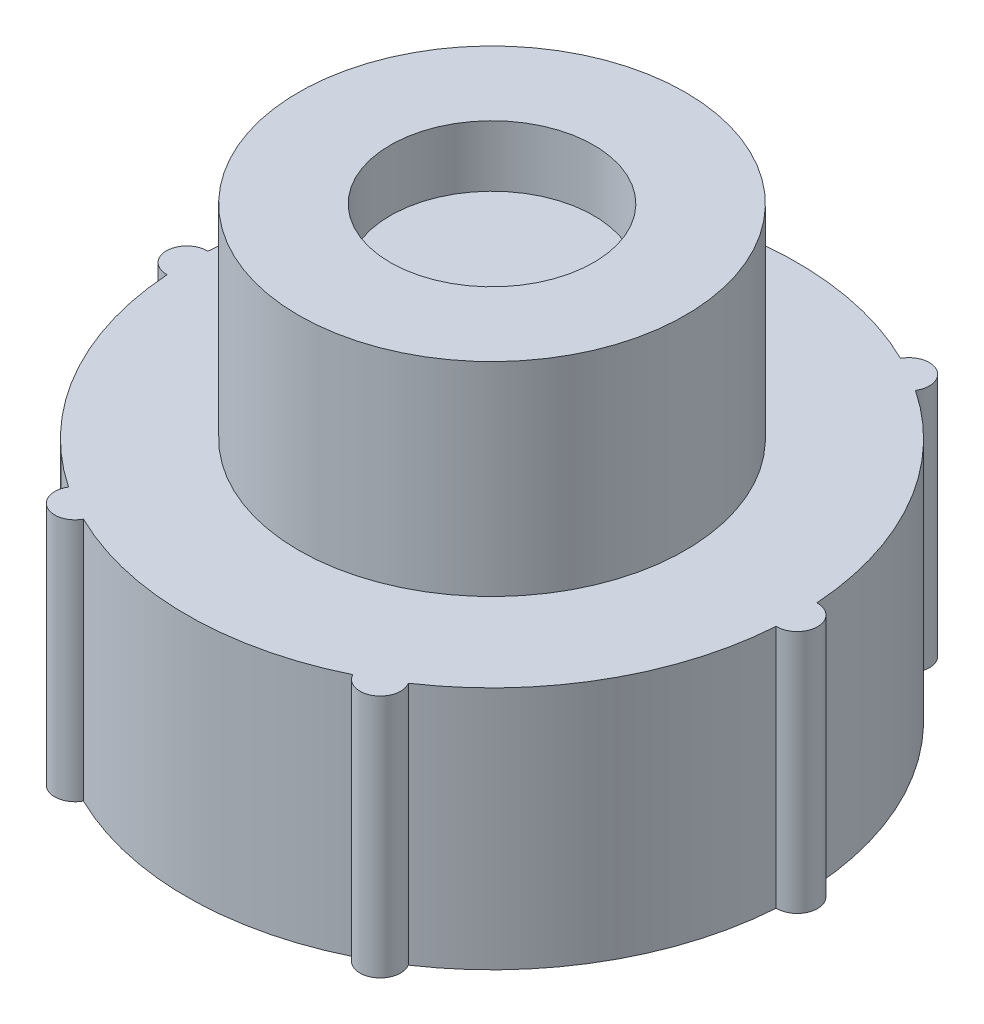
ISO-10303-21;
HEADER;
FILE_DESCRIPTION(('STEP AP214'),'2;1');
FILE_NAME('part.step','',(''),(''),'','','');
FILE_SCHEMA(('AUTOMOTIVE_DESIGN { 1 0 10303 214 1 1 1 1 }'));
ENDSEC;
DATA;
#1=APPLICATION_CONTEXT('core data for automotive mechanical design processes');
#2=APPLICATION_PROTOCOL_DEFINITION('international standard','automotive_design',2000,#1);
#3=PRODUCT_CONTEXT('',#1,'mechanical');
#4=PRODUCT('Part','Part','',(#3));
#5=PRODUCT_RELATED_PRODUCT_CATEGORY('part','',(#4));
#6=PRODUCT_DEFINITION_FORMATION('','',#4);
#7=PRODUCT_DEFINITION_CONTEXT('part definition',#1,'design');
#8=PRODUCT_DEFINITION('design','',#6,#7);
#9=PRODUCT_DEFINITION_SHAPE('','',#8);
#10=(LENGTH_UNIT() NAMED_UNIT(*) SI_UNIT(.MILLI.,.METRE.));
#11=(NAMED_UNIT(*) PLANE_ANGLE_UNIT() SI_UNIT($,.RADIAN.));
#12=(NAMED_UNIT(*) SI_UNIT($,.STERADIAN.) SOLID_ANGLE_UNIT());
#13=UNCERTAINTY_MEASURE_WITH_UNIT(LENGTH_MEASURE(1.E-05),#10,'distance_accuracy_value','');
#14=(GEOMETRIC_REPRESENTATION_CONTEXT(3) GLOBAL_UNCERTAINTY_ASSIGNED_CONTEXT((#13)) GLOBAL_UNIT_ASSIGNED_CONTEXT((#10,
#11,#12)) REPRESENTATION_CONTEXT('',''));
#15=CARTESIAN_POINT('',(0.,0.,0.));
#16=DIRECTION('',(0.,0.,1.));
#17=DIRECTION('',(1.,0.,0.));
#18=AXIS2_PLACEMENT_3D('',#15,#16,#17);
#19=CARTESIAN_POINT('',(0.,12.,0.));
#20=DIRECTION('',(0.,-1.,0.));
#21=DIRECTION('',(0.,0.,-1.));
#22=AXIS2_PLACEMENT_3D('',#19,#20,#21);
#23=CYLINDRICAL_SURFACE('',#22,15.);
#24=CARTESIAN_POINT('',(0.,0.,0.));
#25=DIRECTION('',(0.,1.,0.));
#26=DIRECTION('',(0.,0.,1.));
#27=AXIS2_PLACEMENT_3D('',#24,#25,#26);
#28=CIRCLE('',#27,15.);
#29=CARTESIAN_POINT('',(-6.61778918849326,0.,13.461235688326));
#30=VERTEX_POINT('',#29);
#31=CARTESIAN_POINT('',(6.61778918849357,0.,13.4612356883259));
#32=VERTEX_POINT('',#31);
#33=EDGE_CURVE('E136',#30,#32,#28,.T.);
#34=ORIENTED_EDGE('',*,*,#33,.T.);
#35=DIRECTION('',(0.,-1.,0.));
#36=VECTOR('',#35,1.);
#37=CARTESIAN_POINT('',(6.61778918849357,6.,13.4612356883259));
#38=LINE('',#37,#36);
#39=CARTESIAN_POINT('',(6.61778918849357,12.,13.4612356883259));
#40=VERTEX_POINT('',#39);
#41=EDGE_CURVE('E122',#32,#40,#38,.F.);
#42=ORIENTED_EDGE('',*,*,#41,.T.);
#43=CARTESIAN_POINT('',(0.,12.,0.));
#44=DIRECTION('',(0.,1.,0.));
#45=DIRECTION('',(0.,0.,1.));
#46=AXIS2_PLACEMENT_3D('',#43,#44,#45);
#47=CIRCLE('',#46,15.);
#48=CARTESIAN_POINT('',(-6.61778918849329,12.,13.461235688326));
#49=VERTEX_POINT('',#48);
#50=EDGE_CURVE('E158',#49,#40,#47,.T.);
#51=ORIENTED_EDGE('',*,*,#50,.F.);
#52=DIRECTION('',(0.,-1.,0.));
#53=VECTOR('',#52,1.);
#54=CARTESIAN_POINT('',(-6.61778918849329,6.,13.461235688326));
#55=LINE('',#54,#53);
#56=EDGE_CURVE('E140',#49,#30,#55,.T.);
#57=ORIENTED_EDGE('',*,*,#56,.T.);
#58=EDGE_LOOP('',(#34,#42,#51,#57));
#59=FACE_BOUND('',#58,.T.);
#60=ADVANCED_FACE('F33',(#59),#23,.T.);
#61=CARTESIAN_POINT('',(-14.9666666666667,0.,0.99944429003777));
#62=VERTEX_POINT('',#61);
#63=CARTESIAN_POINT('',(-8.34887747817314,0.,12.4617913982883));
#64=VERTEX_POINT('',#63);
#65=EDGE_CURVE('E141',#62,#64,#28,.T.);
#66=ORIENTED_EDGE('',*,*,#65,.T.);
#67=DIRECTION('',(0.,-1.,0.));
#68=VECTOR('',#67,1.);
#69=CARTESIAN_POINT('',(-8.34887747817314,6.,12.4617913982883));
#70=LINE('',#69,#68);
#71=CARTESIAN_POINT('',(-8.34887747817314,12.,12.4617913982883));
#72=VERTEX_POINT('',#71);
#73=EDGE_CURVE('E182',#64,#72,#70,.F.);
#74=ORIENTED_EDGE('',*,*,#73,.T.);
#75=CARTESIAN_POINT('',(-14.9666666666667,12.,0.999444290037769));
#76=VERTEX_POINT('',#75);
#77=EDGE_CURVE('E230',#76,#72,#47,.T.);
#78=ORIENTED_EDGE('',*,*,#77,.F.);
#79=DIRECTION('',(0.,-1.,0.));
#80=VECTOR('',#79,1.);
#81=CARTESIAN_POINT('',(-14.9666666666667,6.,0.999444290037769));
#82=LINE('',#81,#80);
#83=EDGE_CURVE('E184',#76,#62,#82,.T.);
#84=ORIENTED_EDGE('',*,*,#83,.T.);
#85=EDGE_LOOP('',(#66,#74,#78,#84));
#86=FACE_BOUND('',#85,.T.);
#87=ADVANCED_FACE('F262',(#86),#23,.T.);
#88=CARTESIAN_POINT('',(-8.34887747817333,0.,-12.4617913982882));
#89=VERTEX_POINT('',#88);
#90=CARTESIAN_POINT('',(-14.9666666666667,0.,-0.99944429003756));
#91=VERTEX_POINT('',#90);
#92=EDGE_CURVE('E143',#89,#91,#28,.T.);
#93=ORIENTED_EDGE('',*,*,#92,.T.);
#94=DIRECTION('',(0.,-1.,0.));
#95=VECTOR('',#94,1.);
#96=CARTESIAN_POINT('',(-14.9666666666667,6.,-0.99944429003756));
#97=LINE('',#96,#95);
#98=CARTESIAN_POINT('',(-14.9666666666667,12.,-0.99944429003756));
#99=VERTEX_POINT('',#98);
#100=EDGE_CURVE('E171',#91,#99,#97,.F.);
#101=ORIENTED_EDGE('',*,*,#100,.T.);
#102=CARTESIAN_POINT('',(-8.34887747817331,12.,-12.4617913982882));
#103=VERTEX_POINT('',#102);
#104=EDGE_CURVE('E227',#103,#99,#47,.T.);
#105=ORIENTED_EDGE('',*,*,#104,.F.);
#106=DIRECTION('',(0.,-1.,0.));
#107=VECTOR('',#106,1.);
#108=CARTESIAN_POINT('',(-8.34887747817331,6.,-12.4617913982882));
#109=LINE('',#108,#107);
#110=EDGE_CURVE('E173',#103,#89,#109,.T.);
#111=ORIENTED_EDGE('',*,*,#110,.T.);
#112=EDGE_LOOP('',(#93,#101,#105,#111));
#113=FACE_BOUND('',#112,.T.);
#114=ADVANCED_FACE('F169',(#113),#23,.T.);
#115=CARTESIAN_POINT('',(6.61778918849336,0.,-13.461235688326));
#116=VERTEX_POINT('',#115);
#117=CARTESIAN_POINT('',(-6.61778918849348,0.,-13.4612356883259));
#118=VERTEX_POINT('',#117);
#119=EDGE_CURVE('E153',#116,#118,#28,.T.);
#120=ORIENTED_EDGE('',*,*,#119,.T.);
#121=DIRECTION('',(0.,-1.,0.));
#122=VECTOR('',#121,1.);
#123=CARTESIAN_POINT('',(-6.61778918849348,6.,-13.4612356883259));
#124=LINE('',#123,#122);
#125=CARTESIAN_POINT('',(-6.61778918849348,12.,-13.4612356883259));
#126=VERTEX_POINT('',#125);
#127=EDGE_CURVE('E196',#118,#126,#124,.F.);
#128=ORIENTED_EDGE('',*,*,#127,.T.);
#129=CARTESIAN_POINT('',(6.61778918849338,12.,-13.4612356883259));
#130=VERTEX_POINT('',#129);
#131=EDGE_CURVE('E221',#130,#126,#47,.T.);
#132=ORIENTED_EDGE('',*,*,#131,.F.);
#133=DIRECTION('',(0.,-1.,0.));
#134=VECTOR('',#133,1.);
#135=CARTESIAN_POINT('',(6.61778918849338,6.,-13.4612356883259));
#136=LINE('',#135,#134);
#137=EDGE_CURVE('E203',#130,#116,#136,.T.);
#138=ORIENTED_EDGE('',*,*,#137,.T.);
#139=EDGE_LOOP('',(#120,#128,#132,#138));
#140=FACE_BOUND('',#139,.T.);
#141=ADVANCED_FACE('F248',(#140),#23,.T.);
#142=CARTESIAN_POINT('',(14.9666666666667,0.,-0.999444290037692));
#143=VERTEX_POINT('',#142);
#144=CARTESIAN_POINT('',(8.34887747817322,0.,-12.4617913982883));
#145=VERTEX_POINT('',#144);
#146=EDGE_CURVE('E37',#143,#145,#28,.T.);
#147=ORIENTED_EDGE('',*,*,#146,.T.);
#148=DIRECTION('',(0.,-1.,0.));
#149=VECTOR('',#148,1.);
#150=CARTESIAN_POINT('',(8.34887747817322,6.,-12.4617913982883));
#151=LINE('',#150,#149);
#152=CARTESIAN_POINT('',(8.34887747817322,12.,-12.4617913982883));
#153=VERTEX_POINT('',#152);
#154=EDGE_CURVE('E205',#145,#153,#151,.F.);
#155=ORIENTED_EDGE('',*,*,#154,.T.);
#156=CARTESIAN_POINT('',(14.9666666666667,12.,-0.999444290037663));
#157=VERTEX_POINT('',#156);
#158=EDGE_CURVE('E42',#157,#153,#47,.T.);
#159=ORIENTED_EDGE('',*,*,#158,.F.);
#160=DIRECTION('',(0.,-1.,0.));
#161=VECTOR('',#160,1.);
#162=CARTESIAN_POINT('',(14.9666666666667,6.,-0.999444290037663));
#163=LINE('',#162,#161);
#164=EDGE_CURVE('E212',#157,#143,#163,.T.);
#165=ORIENTED_EDGE('',*,*,#164,.T.);
#166=EDGE_LOOP('',(#147,#155,#159,#165));
#167=FACE_BOUND('',#166,.T.);
#168=ADVANCED_FACE('F245',(#167),#23,.T.);
#169=CARTESIAN_POINT('',(8.3488774781734,12.,12.4617913982882));
#170=VERTEX_POINT('',#169);
#171=CARTESIAN_POINT('',(14.9666666666667,12.,0.999444290037663));
#172=VERTEX_POINT('',#171);
#173=EDGE_CURVE('E152',#170,#172,#47,.T.);
#174=ORIENTED_EDGE('',*,*,#173,.F.);
#175=DIRECTION('',(0.,-1.,0.));
#176=VECTOR('',#175,1.);
#177=CARTESIAN_POINT('',(8.3488774781734,6.,12.4617913982882));
#178=LINE('',#177,#176);
#179=CARTESIAN_POINT('',(8.34887747817342,0.,12.4617913982882));
#180=VERTEX_POINT('',#179);
#181=EDGE_CURVE('E130',#170,#180,#178,.T.);
#182=ORIENTED_EDGE('',*,*,#181,.T.);
#183=CARTESIAN_POINT('',(14.9666666666667,0.,0.999444290037663));
#184=VERTEX_POINT('',#183);
#185=EDGE_CURVE('E138',#180,#184,#28,.T.);
#186=ORIENTED_EDGE('',*,*,#185,.T.);
#187=DIRECTION('',(0.,-1.,0.));
#188=VECTOR('',#187,1.);
#189=CARTESIAN_POINT('',(14.9666666666667,6.,0.999444290037663));
#190=LINE('',#189,#188);
#191=EDGE_CURVE('E214',#184,#172,#190,.F.);
#192=ORIENTED_EDGE('',*,*,#191,.T.);
#193=EDGE_LOOP('',(#174,#182,#186,#192));
#194=FACE_BOUND('',#193,.T.);
#195=ADVANCED_FACE('F35',(#194),#23,.T.);
#196=CARTESIAN_POINT('',(0.,12.,0.));
#197=DIRECTION('',(0.,1.,0.));
#198=DIRECTION('',(0.,0.,1.));
#199=AXIS2_PLACEMENT_3D('',#196,#197,#198);
#200=PLANE('',#199);
#201=ORIENTED_EDGE('',*,*,#50,.T.);
#202=CARTESIAN_POINT('',(7.50000000000015,12.,12.9903810567665));
#203=DIRECTION('',(0.,1.,0.));
#204=DIRECTION('',(0.,0.,1.));
#205=AXIS2_PLACEMENT_3D('',#202,#203,#204);
#206=CIRCLE('',#205,0.999999999999999);
#207=EDGE_CURVE('E125',#170,#40,#206,.F.);
#208=ORIENTED_EDGE('',*,*,#207,.F.);
#209=ORIENTED_EDGE('',*,*,#173,.T.);
#210=CARTESIAN_POINT('',(15.,12.,0.));
#211=DIRECTION('',(0.,1.,0.));
#212=DIRECTION('',(0.,0.,1.));
#213=AXIS2_PLACEMENT_3D('',#210,#211,#212);
#214=CIRCLE('',#213,1.);
#215=EDGE_CURVE('E209',#157,#172,#214,.F.);
#216=ORIENTED_EDGE('',*,*,#215,.F.);
#217=ORIENTED_EDGE('',*,*,#158,.T.);
#218=CARTESIAN_POINT('',(7.49999999999997,12.,-12.9903810567666));
#219=DIRECTION('',(0.,1.,0.));
#220=DIRECTION('',(0.,0.,1.));
#221=AXIS2_PLACEMENT_3D('',#218,#219,#220);
#222=CIRCLE('',#221,1.);
#223=EDGE_CURVE('E201',#130,#153,#222,.F.);
#224=ORIENTED_EDGE('',*,*,#223,.F.);
#225=ORIENTED_EDGE('',*,*,#131,.T.);
#226=CARTESIAN_POINT('',(-7.50000000000006,12.,-12.9903810567666));
#227=DIRECTION('',(0.,1.,0.));
#228=DIRECTION('',(0.,0.,1.));
#229=AXIS2_PLACEMENT_3D('',#226,#227,#228);
#230=CIRCLE('',#229,0.999999999999999);
#231=EDGE_CURVE('E193',#103,#126,#230,.F.);
#232=ORIENTED_EDGE('',*,*,#231,.F.);
#233=ORIENTED_EDGE('',*,*,#104,.T.);
#234=CARTESIAN_POINT('',(-15.,12.,1.04744440165294E-13));
#235=DIRECTION('',(0.,1.,0.));
#236=DIRECTION('',(0.,0.,1.));
#237=AXIS2_PLACEMENT_3D('',#234,#235,#236);
#238=CIRCLE('',#237,1.);
#239=EDGE_CURVE('E181',#76,#99,#238,.F.);
#240=ORIENTED_EDGE('',*,*,#239,.F.);
#241=ORIENTED_EDGE('',*,*,#77,.T.);
#242=CARTESIAN_POINT('',(-7.49999999999988,12.,12.9903810567666));
#243=DIRECTION('',(0.,1.,0.));
#244=DIRECTION('',(0.,0.,1.));
#245=AXIS2_PLACEMENT_3D('',#242,#243,#244);
#246=CIRCLE('',#245,1.);
#247=EDGE_CURVE('E238',#49,#72,#246,.F.);
#248=ORIENTED_EDGE('',*,*,#247,.F.);
#249=EDGE_LOOP('',(#201,#208,#209,#216,#217,#224,#225,#232,#233,#240,#241,#248));
#250=FACE_BOUND('',#249,.T.);
#251=CARTESIAN_POINT('',(0.,12.,0.));
#252=DIRECTION('',(0.,1.,0.));
#253=DIRECTION('',(0.,0.,1.));
#254=AXIS2_PLACEMENT_3D('',#251,#252,#253);
#255=CIRCLE('',#254,9.5);
#256=CARTESIAN_POINT('',(0.,12.,9.5));
#257=VERTEX_POINT('',#256);
#258=EDGE_CURVE('E11',#257,#257,#255,.T.);
#259=ORIENTED_EDGE('',*,*,#258,.F.);
#260=EDGE_LOOP('',(#259));
#261=FACE_BOUND('',#260,.T.);
#262=ADVANCED_FACE('F235',(#250,#261),#200,.T.);
#263=CARTESIAN_POINT('',(0.,0.,0.));
#264=DIRECTION('',(0.,1.,0.));
#265=DIRECTION('',(0.,0.,1.));
#266=AXIS2_PLACEMENT_3D('',#263,#264,#265);
#267=PLANE('',#266);
#268=ORIENTED_EDGE('',*,*,#185,.F.);
#269=CARTESIAN_POINT('',(7.50000000000015,0.,12.9903810567665));
#270=DIRECTION('',(0.,-1.,0.));
#271=DIRECTION('',(0.,0.,-1.));
#272=AXIS2_PLACEMENT_3D('',#269,#270,#271);
#273=CIRCLE('',#272,0.999999999999999);
#274=EDGE_CURVE('E50',#180,#32,#273,.T.);
#275=ORIENTED_EDGE('',*,*,#274,.T.);
#276=ORIENTED_EDGE('',*,*,#33,.F.);
#277=CARTESIAN_POINT('',(-7.49999999999988,0.,12.9903810567666));
#278=DIRECTION('',(0.,-1.,0.));
#279=DIRECTION('',(0.,0.,-1.));
#280=AXIS2_PLACEMENT_3D('',#277,#278,#279);
#281=CIRCLE('',#280,1.);
#282=EDGE_CURVE('E58',#30,#64,#281,.T.);
#283=ORIENTED_EDGE('',*,*,#282,.T.);
#284=ORIENTED_EDGE('',*,*,#65,.F.);
#285=CARTESIAN_POINT('',(-15.,0.,1.04744440165294E-13));
#286=DIRECTION('',(0.,-1.,0.));
#287=DIRECTION('',(0.,0.,-1.));
#288=AXIS2_PLACEMENT_3D('',#285,#286,#287);
#289=CIRCLE('',#288,1.);
#290=EDGE_CURVE('E178',#62,#91,#289,.T.);
#291=ORIENTED_EDGE('',*,*,#290,.T.);
#292=ORIENTED_EDGE('',*,*,#92,.F.);
#293=CARTESIAN_POINT('',(-7.50000000000006,0.,-12.9903810567666));
#294=DIRECTION('',(0.,-1.,0.));
#295=DIRECTION('',(0.,0.,-1.));
#296=AXIS2_PLACEMENT_3D('',#293,#294,#295);
#297=CIRCLE('',#296,0.999999999999999);
#298=EDGE_CURVE('E176',#89,#118,#297,.T.);
#299=ORIENTED_EDGE('',*,*,#298,.T.);
#300=ORIENTED_EDGE('',*,*,#119,.F.);
#301=CARTESIAN_POINT('',(7.49999999999997,0.,-12.9903810567666));
#302=DIRECTION('',(0.,-1.,0.));
#303=DIRECTION('',(0.,0.,-1.));
#304=AXIS2_PLACEMENT_3D('',#301,#302,#303);
#305=CIRCLE('',#304,1.);
#306=EDGE_CURVE('E198',#116,#145,#305,.T.);
#307=ORIENTED_EDGE('',*,*,#306,.T.);
#308=ORIENTED_EDGE('',*,*,#146,.F.);
#309=CARTESIAN_POINT('',(15.,0.,0.));
#310=DIRECTION('',(0.,-1.,0.));
#311=DIRECTION('',(0.,0.,-1.));
#312=AXIS2_PLACEMENT_3D('',#309,#310,#311);
#313=CIRCLE('',#312,1.);
#314=EDGE_CURVE('E207',#143,#184,#313,.T.);
#315=ORIENTED_EDGE('',*,*,#314,.T.);
#316=EDGE_LOOP('',(#268,#275,#276,#283,#284,#291,#292,#299,#300,#307,#308,#315));
#317=FACE_BOUND('',#316,.T.);
#318=ADVANCED_FACE('F135',(#317),#267,.F.);
#319=CARTESIAN_POINT('',(0.,22.,0.));
#320=DIRECTION('',(0.,-1.,0.));
#321=DIRECTION('',(0.,0.,-1.));
#322=AXIS2_PLACEMENT_3D('',#319,#320,#321);
#323=CYLINDRICAL_SURFACE('',#322,9.5);
#324=CARTESIAN_POINT('',(0.,22.,0.));
#325=DIRECTION('',(0.,1.,0.));
#326=DIRECTION('',(0.,0.,1.));
#327=AXIS2_PLACEMENT_3D('',#324,#325,#326);
#328=CIRCLE('',#327,9.5);
#329=CARTESIAN_POINT('',(0.,22.,9.5));
#330=VERTEX_POINT('',#329);
#331=EDGE_CURVE('E144',#330,#330,#328,.T.);
#332=ORIENTED_EDGE('',*,*,#331,.F.);
#333=EDGE_LOOP('',(#332));
#334=FACE_BOUND('',#333,.T.);
#335=ORIENTED_EDGE('',*,*,#258,.T.);
#336=EDGE_LOOP('',(#335));
#337=FACE_BOUND('',#336,.T.);
#338=ADVANCED_FACE('F322',(#334,#337),#323,.T.);
#339=CARTESIAN_POINT('',(0.,22.,0.));
#340=DIRECTION('',(0.,1.,0.));
#341=DIRECTION('',(0.,0.,1.));
#342=AXIS2_PLACEMENT_3D('',#339,#340,#341);
#343=PLANE('',#342);
#344=CARTESIAN_POINT('',(0.,22.,0.));
#345=DIRECTION('',(0.,1.,0.));
#346=DIRECTION('',(0.,0.,1.));
#347=AXIS2_PLACEMENT_3D('',#344,#345,#346);
#348=CIRCLE('',#347,5.);
#349=CARTESIAN_POINT('',(0.,22.,5.));
#350=VERTEX_POINT('',#349);
#351=EDGE_CURVE('E216',#350,#350,#348,.T.);
#352=ORIENTED_EDGE('',*,*,#351,.F.);
#353=EDGE_LOOP('',(#352));
#354=FACE_BOUND('',#353,.T.);
#355=ORIENTED_EDGE('',*,*,#331,.T.);
#356=EDGE_LOOP('',(#355));
#357=FACE_BOUND('',#356,.T.);
#358=ADVANCED_FACE('F312',(#354,#357),#343,.T.);
#359=CARTESIAN_POINT('',(0.,19.,0.));
#360=DIRECTION('',(0.,1.,0.));
#361=DIRECTION('',(0.,0.,1.));
#362=AXIS2_PLACEMENT_3D('',#359,#360,#361);
#363=CYLINDRICAL_SURFACE('',#362,5.);
#364=CARTESIAN_POINT('',(0.,19.,0.));
#365=DIRECTION('',(0.,1.,0.));
#366=DIRECTION('',(0.,0.,1.));
#367=AXIS2_PLACEMENT_3D('',#364,#365,#366);
#368=CIRCLE('',#367,5.);
#369=CARTESIAN_POINT('',(0.,19.,5.));
#370=VERTEX_POINT('',#369);
#371=EDGE_CURVE('E149',#370,#370,#368,.T.);
#372=ORIENTED_EDGE('',*,*,#371,.F.);
#373=EDGE_LOOP('',(#372));
#374=FACE_BOUND('',#373,.T.);
#375=ORIENTED_EDGE('',*,*,#351,.T.);
#376=EDGE_LOOP('',(#375));
#377=FACE_BOUND('',#376,.T.);
#378=ADVANCED_FACE('F300',(#374,#377),#363,.F.);
#379=CARTESIAN_POINT('',(0.,19.,0.));
#380=DIRECTION('',(0.,1.,0.));
#381=DIRECTION('',(0.,0.,1.));
#382=AXIS2_PLACEMENT_3D('',#379,#380,#381);
#383=PLANE('',#382);
#384=ORIENTED_EDGE('',*,*,#371,.T.);
#385=EDGE_LOOP('',(#384));
#386=FACE_BOUND('',#385,.T.);
#387=ADVANCED_FACE('F295',(#386),#383,.T.);
#388=CARTESIAN_POINT('',(15.,14.8284271247462,0.));
#389=DIRECTION('',(0.,-1.,0.));
#390=DIRECTION('',(0.,0.,-1.));
#391=AXIS2_PLACEMENT_3D('',#388,#389,#390);
#392=CYLINDRICAL_SURFACE('',#391,1.);
#393=ORIENTED_EDGE('',*,*,#191,.F.);
#394=ORIENTED_EDGE('',*,*,#314,.F.);
#395=ORIENTED_EDGE('',*,*,#164,.F.);
#396=ORIENTED_EDGE('',*,*,#215,.T.);
#397=EDGE_LOOP('',(#393,#394,#395,#396));
#398=FACE_BOUND('',#397,.T.);
#399=ADVANCED_FACE('F244',(#398),#392,.T.);
#400=CARTESIAN_POINT('',(7.49999999999997,14.8284271247462,-12.9903810567666));
#401=DIRECTION('',(0.,-1.,0.));
#402=DIRECTION('',(0.,0.,-1.));
#403=AXIS2_PLACEMENT_3D('',#400,#401,#402);
#404=CYLINDRICAL_SURFACE('',#403,1.);
#405=ORIENTED_EDGE('',*,*,#154,.F.);
#406=ORIENTED_EDGE('',*,*,#306,.F.);
#407=ORIENTED_EDGE('',*,*,#137,.F.);
#408=ORIENTED_EDGE('',*,*,#223,.T.);
#409=EDGE_LOOP('',(#405,#406,#407,#408));
#410=FACE_BOUND('',#409,.T.);
#411=ADVANCED_FACE('F247',(#410),#404,.T.);
#412=CARTESIAN_POINT('',(-7.50000000000006,14.8284271247462,-12.9903810567666));
#413=DIRECTION('',(0.,-1.,0.));
#414=DIRECTION('',(0.,0.,-1.));
#415=AXIS2_PLACEMENT_3D('',#412,#413,#414);
#416=CYLINDRICAL_SURFACE('',#415,0.999999999999999);
#417=ORIENTED_EDGE('',*,*,#127,.F.);
#418=ORIENTED_EDGE('',*,*,#298,.F.);
#419=ORIENTED_EDGE('',*,*,#110,.F.);
#420=ORIENTED_EDGE('',*,*,#231,.T.);
#421=EDGE_LOOP('',(#417,#418,#419,#420));
#422=FACE_BOUND('',#421,.T.);
#423=ADVANCED_FACE('F250',(#422),#416,.T.);
#424=CARTESIAN_POINT('',(-15.,14.8284271247462,1.04744440165294E-13));
#425=DIRECTION('',(0.,-1.,0.));
#426=DIRECTION('',(0.,0.,-1.));
#427=AXIS2_PLACEMENT_3D('',#424,#425,#426);
#428=CYLINDRICAL_SURFACE('',#427,1.);
#429=ORIENTED_EDGE('',*,*,#100,.F.);
#430=ORIENTED_EDGE('',*,*,#290,.F.);
#431=ORIENTED_EDGE('',*,*,#83,.F.);
#432=ORIENTED_EDGE('',*,*,#239,.T.);
#433=EDGE_LOOP('',(#429,#430,#431,#432));
#434=FACE_BOUND('',#433,.T.);
#435=ADVANCED_FACE('F252',(#434),#428,.T.);
#436=CARTESIAN_POINT('',(-7.49999999999988,14.8284271247462,12.9903810567666));
#437=DIRECTION('',(0.,-1.,0.));
#438=DIRECTION('',(0.,0.,-1.));
#439=AXIS2_PLACEMENT_3D('',#436,#437,#438);
#440=CYLINDRICAL_SURFACE('',#439,1.);
#441=ORIENTED_EDGE('',*,*,#73,.F.);
#442=ORIENTED_EDGE('',*,*,#282,.F.);
#443=ORIENTED_EDGE('',*,*,#56,.F.);
#444=ORIENTED_EDGE('',*,*,#247,.T.);
#445=EDGE_LOOP('',(#441,#442,#443,#444));
#446=FACE_BOUND('',#445,.T.);
#447=ADVANCED_FACE('F258',(#446),#440,.T.);
#448=CARTESIAN_POINT('',(7.50000000000015,14.8284271247462,12.9903810567665));
#449=DIRECTION('',(0.,-1.,0.));
#450=DIRECTION('',(0.,0.,-1.));
#451=AXIS2_PLACEMENT_3D('',#448,#449,#450);
#452=CYLINDRICAL_SURFACE('',#451,0.999999999999999);
#453=ORIENTED_EDGE('',*,*,#41,.F.);
#454=ORIENTED_EDGE('',*,*,#274,.F.);
#455=ORIENTED_EDGE('',*,*,#181,.F.);
#456=ORIENTED_EDGE('',*,*,#207,.T.);
#457=EDGE_LOOP('',(#453,#454,#455,#456));
#458=FACE_BOUND('',#457,.T.);
#459=ADVANCED_FACE('F123',(#458),#452,.T.);
#460=CLOSED_SHELL('',(#60,#87,#114,#141,#168,#195,#262,#318,#338,#358,#378,#387,#399,#411,#423,
#435,#447,#459));
#461=MANIFOLD_SOLID_BREP('B2',#460);
#462=ADVANCED_BREP_SHAPE_REPRESENTATION('',(#18,#461),#14);
#463=SHAPE_DEFINITION_REPRESENTATION(#9,#462);
ENDSEC;
END-ISO-10303-21;
